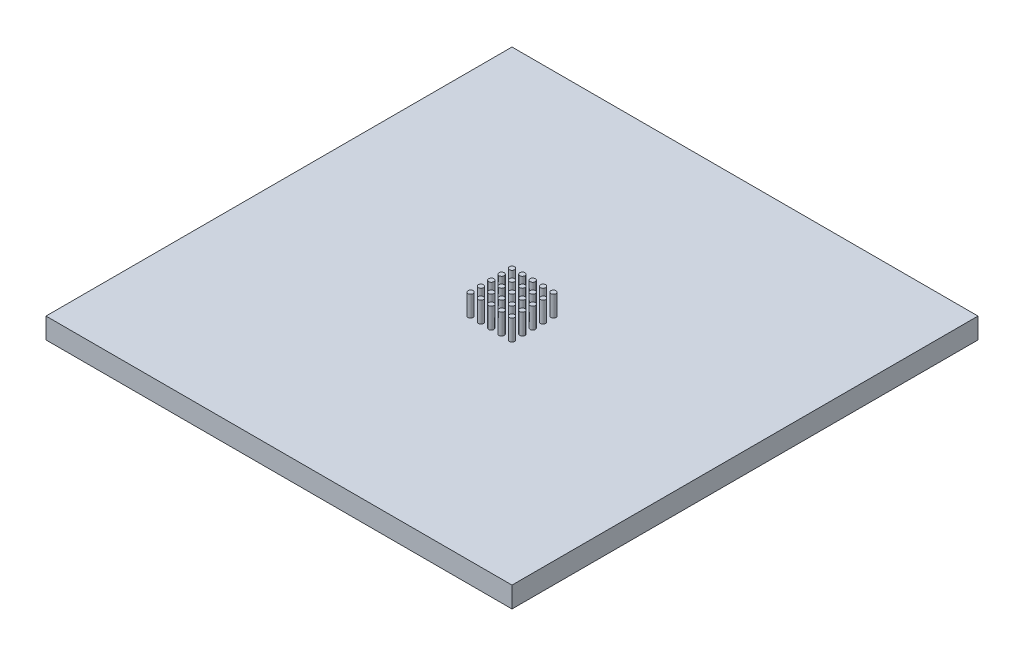
ISO-10303-21;
HEADER;
FILE_DESCRIPTION(('STEP AP214'),'2;1');
FILE_NAME('part.step','',(''),(''),'','','');
FILE_SCHEMA(('AUTOMOTIVE_DESIGN { 1 0 10303 214 1 1 1 1 }'));
ENDSEC;
DATA;
#1=APPLICATION_CONTEXT('core data for automotive mechanical design processes');
#2=APPLICATION_PROTOCOL_DEFINITION('international standard','automotive_design',2000,#1);
#3=PRODUCT_CONTEXT('',#1,'mechanical');
#4=PRODUCT('Part','Part','',(#3));
#5=PRODUCT_RELATED_PRODUCT_CATEGORY('part','',(#4));
#6=PRODUCT_DEFINITION_FORMATION('','',#4);
#7=PRODUCT_DEFINITION_CONTEXT('part definition',#1,'design');
#8=PRODUCT_DEFINITION('design','',#6,#7);
#9=PRODUCT_DEFINITION_SHAPE('','',#8);
#10=(LENGTH_UNIT() NAMED_UNIT(*) SI_UNIT(.MILLI.,.METRE.));
#11=(NAMED_UNIT(*) PLANE_ANGLE_UNIT() SI_UNIT($,.RADIAN.));
#12=(NAMED_UNIT(*) SI_UNIT($,.STERADIAN.) SOLID_ANGLE_UNIT());
#13=UNCERTAINTY_MEASURE_WITH_UNIT(LENGTH_MEASURE(1.E-05),#10,'distance_accuracy_value','');
#14=(GEOMETRIC_REPRESENTATION_CONTEXT(3) GLOBAL_UNCERTAINTY_ASSIGNED_CONTEXT((#13)) GLOBAL_UNIT_ASSIGNED_CONTEXT((#10,
#11,#12)) REPRESENTATION_CONTEXT('',''));
#15=CARTESIAN_POINT('',(0.,0.,0.));
#16=DIRECTION('',(0.,0.,1.));
#17=DIRECTION('',(1.,0.,0.));
#18=AXIS2_PLACEMENT_3D('',#15,#16,#17);
#19=CARTESIAN_POINT('',(2.,4.,-2.));
#20=DIRECTION('',(0.,1.,0.));
#21=DIRECTION('',(0.,0.,1.));
#22=AXIS2_PLACEMENT_3D('',#19,#20,#21);
#23=PLANE('',#22);
#24=CARTESIAN_POINT('',(2.,4.,-2.));
#25=DIRECTION('',(0.,1.,0.));
#26=DIRECTION('',(0.,0.,1.));
#27=AXIS2_PLACEMENT_3D('',#24,#25,#26);
#28=CIRCLE('',#27,0.25);
#29=CARTESIAN_POINT('',(2.,4.,-1.75));
#30=VERTEX_POINT('',#29);
#31=EDGE_CURVE('E11',#30,#30,#28,.T.);
#32=ORIENTED_EDGE('',*,*,#31,.T.);
#33=EDGE_LOOP('',(#32));
#34=FACE_BOUND('',#33,.T.);
#35=ADVANCED_FACE('F47',(#34),#23,.T.);
#36=CARTESIAN_POINT('',(2.,4.,-2.));
#37=DIRECTION('',(0.,-1.,0.));
#38=DIRECTION('',(0.,0.,-1.));
#39=AXIS2_PLACEMENT_3D('',#36,#37,#38);
#40=CYLINDRICAL_SURFACE('',#39,0.25);
#41=ORIENTED_EDGE('',*,*,#31,.F.);
#42=EDGE_LOOP('',(#41));
#43=FACE_BOUND('',#42,.T.);
#44=CARTESIAN_POINT('',(2.,2.,-2.));
#45=DIRECTION('',(0.,1.,0.));
#46=DIRECTION('',(0.,0.,1.));
#47=AXIS2_PLACEMENT_3D('',#44,#45,#46);
#48=CIRCLE('',#47,0.25);
#49=CARTESIAN_POINT('',(2.,2.,-1.75));
#50=VERTEX_POINT('',#49);
#51=EDGE_CURVE('E59',#50,#50,#48,.T.);
#52=ORIENTED_EDGE('',*,*,#51,.T.);
#53=EDGE_LOOP('',(#52));
#54=FACE_BOUND('',#53,.T.);
#55=ADVANCED_FACE('F321',(#43,#54),#40,.T.);
#56=CARTESIAN_POINT('',(2.,4.,-1.));
#57=DIRECTION('',(0.,1.,0.));
#58=DIRECTION('',(0.,0.,1.));
#59=AXIS2_PLACEMENT_3D('',#56,#57,#58);
#60=PLANE('',#59);
#61=CARTESIAN_POINT('',(2.,4.,-1.));
#62=DIRECTION('',(0.,1.,0.));
#63=DIRECTION('',(0.,0.,1.));
#64=AXIS2_PLACEMENT_3D('',#61,#62,#63);
#65=CIRCLE('',#64,0.25);
#66=CARTESIAN_POINT('',(2.,4.,-0.75));
#67=VERTEX_POINT('',#66);
#68=EDGE_CURVE('E311',#67,#67,#65,.T.);
#69=ORIENTED_EDGE('',*,*,#68,.T.);
#70=EDGE_LOOP('',(#69));
#71=FACE_BOUND('',#70,.T.);
#72=ADVANCED_FACE('F344',(#71),#60,.T.);
#73=CARTESIAN_POINT('',(2.,4.,-1.));
#74=DIRECTION('',(0.,-1.,0.));
#75=DIRECTION('',(0.,0.,-1.));
#76=AXIS2_PLACEMENT_3D('',#73,#74,#75);
#77=CYLINDRICAL_SURFACE('',#76,0.25);
#78=ORIENTED_EDGE('',*,*,#68,.F.);
#79=EDGE_LOOP('',(#78));
#80=FACE_BOUND('',#79,.T.);
#81=CARTESIAN_POINT('',(2.,2.,-1.));
#82=DIRECTION('',(0.,1.,0.));
#83=DIRECTION('',(0.,0.,1.));
#84=AXIS2_PLACEMENT_3D('',#81,#82,#83);
#85=CIRCLE('',#84,0.25);
#86=CARTESIAN_POINT('',(2.,2.,-0.75));
#87=VERTEX_POINT('',#86);
#88=EDGE_CURVE('E310',#87,#87,#85,.T.);
#89=ORIENTED_EDGE('',*,*,#88,.T.);
#90=EDGE_LOOP('',(#89));
#91=FACE_BOUND('',#90,.T.);
#92=ADVANCED_FACE('F350',(#80,#91),#77,.T.);
#93=CARTESIAN_POINT('',(2.,4.,0.));
#94=DIRECTION('',(0.,1.,0.));
#95=DIRECTION('',(0.,0.,1.));
#96=AXIS2_PLACEMENT_3D('',#93,#94,#95);
#97=PLANE('',#96);
#98=CARTESIAN_POINT('',(2.,4.,0.));
#99=DIRECTION('',(0.,1.,0.));
#100=DIRECTION('',(0.,0.,1.));
#101=AXIS2_PLACEMENT_3D('',#98,#99,#100);
#102=CIRCLE('',#101,0.25);
#103=CARTESIAN_POINT('',(2.,4.,0.25));
#104=VERTEX_POINT('',#103);
#105=EDGE_CURVE('E303',#104,#104,#102,.T.);
#106=ORIENTED_EDGE('',*,*,#105,.T.);
#107=EDGE_LOOP('',(#106));
#108=FACE_BOUND('',#107,.T.);
#109=ADVANCED_FACE('F352',(#108),#97,.T.);
#110=CARTESIAN_POINT('',(2.,4.,0.));
#111=DIRECTION('',(0.,-1.,0.));
#112=DIRECTION('',(0.,0.,-1.));
#113=AXIS2_PLACEMENT_3D('',#110,#111,#112);
#114=CYLINDRICAL_SURFACE('',#113,0.25);
#115=ORIENTED_EDGE('',*,*,#105,.F.);
#116=EDGE_LOOP('',(#115));
#117=FACE_BOUND('',#116,.T.);
#118=CARTESIAN_POINT('',(2.,2.,0.));
#119=DIRECTION('',(0.,1.,0.));
#120=DIRECTION('',(0.,0.,1.));
#121=AXIS2_PLACEMENT_3D('',#118,#119,#120);
#122=CIRCLE('',#121,0.25);
#123=CARTESIAN_POINT('',(2.,2.,0.25));
#124=VERTEX_POINT('',#123);
#125=EDGE_CURVE('E302',#124,#124,#122,.T.);
#126=ORIENTED_EDGE('',*,*,#125,.T.);
#127=EDGE_LOOP('',(#126));
#128=FACE_BOUND('',#127,.T.);
#129=ADVANCED_FACE('F359',(#117,#128),#114,.T.);
#130=CARTESIAN_POINT('',(2.,4.,1.));
#131=DIRECTION('',(0.,1.,0.));
#132=DIRECTION('',(0.,0.,1.));
#133=AXIS2_PLACEMENT_3D('',#130,#131,#132);
#134=PLANE('',#133);
#135=CARTESIAN_POINT('',(2.,4.,1.));
#136=DIRECTION('',(0.,1.,0.));
#137=DIRECTION('',(0.,0.,1.));
#138=AXIS2_PLACEMENT_3D('',#135,#136,#137);
#139=CIRCLE('',#138,0.25);
#140=CARTESIAN_POINT('',(2.,4.,1.25));
#141=VERTEX_POINT('',#140);
#142=EDGE_CURVE('E300',#141,#141,#139,.T.);
#143=ORIENTED_EDGE('',*,*,#142,.T.);
#144=EDGE_LOOP('',(#143));
#145=FACE_BOUND('',#144,.T.);
#146=ADVANCED_FACE('F363',(#145),#134,.T.);
#147=CARTESIAN_POINT('',(2.,4.,1.));
#148=DIRECTION('',(0.,-1.,0.));
#149=DIRECTION('',(0.,0.,-1.));
#150=AXIS2_PLACEMENT_3D('',#147,#148,#149);
#151=CYLINDRICAL_SURFACE('',#150,0.25);
#152=ORIENTED_EDGE('',*,*,#142,.F.);
#153=EDGE_LOOP('',(#152));
#154=FACE_BOUND('',#153,.T.);
#155=CARTESIAN_POINT('',(2.,2.,1.));
#156=DIRECTION('',(0.,1.,0.));
#157=DIRECTION('',(0.,0.,1.));
#158=AXIS2_PLACEMENT_3D('',#155,#156,#157);
#159=CIRCLE('',#158,0.25);
#160=CARTESIAN_POINT('',(2.,2.,1.25));
#161=VERTEX_POINT('',#160);
#162=EDGE_CURVE('E291',#161,#161,#159,.T.);
#163=ORIENTED_EDGE('',*,*,#162,.T.);
#164=EDGE_LOOP('',(#163));
#165=FACE_BOUND('',#164,.T.);
#166=ADVANCED_FACE('F364',(#154,#165),#151,.T.);
#167=CARTESIAN_POINT('',(2.,4.,2.));
#168=DIRECTION('',(0.,1.,0.));
#169=DIRECTION('',(0.,0.,1.));
#170=AXIS2_PLACEMENT_3D('',#167,#168,#169);
#171=PLANE('',#170);
#172=CARTESIAN_POINT('',(2.,4.,2.));
#173=DIRECTION('',(0.,1.,0.));
#174=DIRECTION('',(0.,0.,1.));
#175=AXIS2_PLACEMENT_3D('',#172,#173,#174);
#176=CIRCLE('',#175,0.25);
#177=CARTESIAN_POINT('',(2.,4.,2.25));
#178=VERTEX_POINT('',#177);
#179=EDGE_CURVE('E286',#178,#178,#176,.T.);
#180=ORIENTED_EDGE('',*,*,#179,.T.);
#181=EDGE_LOOP('',(#180));
#182=FACE_BOUND('',#181,.T.);
#183=ADVANCED_FACE('F369',(#182),#171,.T.);
#184=CARTESIAN_POINT('',(2.,4.,2.));
#185=DIRECTION('',(0.,-1.,0.));
#186=DIRECTION('',(0.,0.,-1.));
#187=AXIS2_PLACEMENT_3D('',#184,#185,#186);
#188=CYLINDRICAL_SURFACE('',#187,0.25);
#189=ORIENTED_EDGE('',*,*,#179,.F.);
#190=EDGE_LOOP('',(#189));
#191=FACE_BOUND('',#190,.T.);
#192=CARTESIAN_POINT('',(2.,2.,2.));
#193=DIRECTION('',(0.,1.,0.));
#194=DIRECTION('',(0.,0.,1.));
#195=AXIS2_PLACEMENT_3D('',#192,#193,#194);
#196=CIRCLE('',#195,0.25);
#197=CARTESIAN_POINT('',(2.,2.,2.25));
#198=VERTEX_POINT('',#197);
#199=EDGE_CURVE('E284',#198,#198,#196,.T.);
#200=ORIENTED_EDGE('',*,*,#199,.T.);
#201=EDGE_LOOP('',(#200));
#202=FACE_BOUND('',#201,.T.);
#203=ADVANCED_FACE('F373',(#191,#202),#188,.T.);
#204=CARTESIAN_POINT('',(1.,4.,-2.));
#205=DIRECTION('',(0.,1.,0.));
#206=DIRECTION('',(0.,0.,1.));
#207=AXIS2_PLACEMENT_3D('',#204,#205,#206);
#208=PLANE('',#207);
#209=CARTESIAN_POINT('',(1.,4.,-2.));
#210=DIRECTION('',(0.,1.,0.));
#211=DIRECTION('',(0.,0.,1.));
#212=AXIS2_PLACEMENT_3D('',#209,#210,#211);
#213=CIRCLE('',#212,0.25);
#214=CARTESIAN_POINT('',(1.,4.,-1.75));
#215=VERTEX_POINT('',#214);
#216=EDGE_CURVE('E281',#215,#215,#213,.T.);
#217=ORIENTED_EDGE('',*,*,#216,.T.);
#218=EDGE_LOOP('',(#217));
#219=FACE_BOUND('',#218,.T.);
#220=ADVANCED_FACE('F380',(#219),#208,.T.);
#221=CARTESIAN_POINT('',(1.,4.,-2.));
#222=DIRECTION('',(0.,-1.,0.));
#223=DIRECTION('',(0.,0.,-1.));
#224=AXIS2_PLACEMENT_3D('',#221,#222,#223);
#225=CYLINDRICAL_SURFACE('',#224,0.25);
#226=ORIENTED_EDGE('',*,*,#216,.F.);
#227=EDGE_LOOP('',(#226));
#228=FACE_BOUND('',#227,.T.);
#229=CARTESIAN_POINT('',(1.,2.,-2.));
#230=DIRECTION('',(0.,1.,0.));
#231=DIRECTION('',(0.,0.,1.));
#232=AXIS2_PLACEMENT_3D('',#229,#230,#231);
#233=CIRCLE('',#232,0.25);
#234=CARTESIAN_POINT('',(1.,2.,-1.75));
#235=VERTEX_POINT('',#234);
#236=EDGE_CURVE('E280',#235,#235,#233,.T.);
#237=ORIENTED_EDGE('',*,*,#236,.T.);
#238=EDGE_LOOP('',(#237));
#239=FACE_BOUND('',#238,.T.);
#240=ADVANCED_FACE('F381',(#228,#239),#225,.T.);
#241=CARTESIAN_POINT('',(1.,4.,-1.));
#242=DIRECTION('',(0.,1.,0.));
#243=DIRECTION('',(0.,0.,1.));
#244=AXIS2_PLACEMENT_3D('',#241,#242,#243);
#245=PLANE('',#244);
#246=CARTESIAN_POINT('',(1.,4.,-1.));
#247=DIRECTION('',(0.,1.,0.));
#248=DIRECTION('',(0.,0.,1.));
#249=AXIS2_PLACEMENT_3D('',#246,#247,#248);
#250=CIRCLE('',#249,0.25);
#251=CARTESIAN_POINT('',(1.,4.,-0.75));
#252=VERTEX_POINT('',#251);
#253=EDGE_CURVE('E272',#252,#252,#250,.T.);
#254=ORIENTED_EDGE('',*,*,#253,.T.);
#255=EDGE_LOOP('',(#254));
#256=FACE_BOUND('',#255,.T.);
#257=ADVANCED_FACE('F384',(#256),#245,.T.);
#258=CARTESIAN_POINT('',(1.,4.,-1.));
#259=DIRECTION('',(0.,-1.,0.));
#260=DIRECTION('',(0.,0.,-1.));
#261=AXIS2_PLACEMENT_3D('',#258,#259,#260);
#262=CYLINDRICAL_SURFACE('',#261,0.25);
#263=ORIENTED_EDGE('',*,*,#253,.F.);
#264=EDGE_LOOP('',(#263));
#265=FACE_BOUND('',#264,.T.);
#266=CARTESIAN_POINT('',(1.,2.,-1.));
#267=DIRECTION('',(0.,1.,0.));
#268=DIRECTION('',(0.,0.,1.));
#269=AXIS2_PLACEMENT_3D('',#266,#267,#268);
#270=CIRCLE('',#269,0.25);
#271=CARTESIAN_POINT('',(1.,2.,-0.75));
#272=VERTEX_POINT('',#271);
#273=EDGE_CURVE('E267',#272,#272,#270,.T.);
#274=ORIENTED_EDGE('',*,*,#273,.T.);
#275=EDGE_LOOP('',(#274));
#276=FACE_BOUND('',#275,.T.);
#277=ADVANCED_FACE('F386',(#265,#276),#262,.T.);
#278=CARTESIAN_POINT('',(1.,4.,0.));
#279=DIRECTION('',(0.,1.,0.));
#280=DIRECTION('',(0.,0.,1.));
#281=AXIS2_PLACEMENT_3D('',#278,#279,#280);
#282=PLANE('',#281);
#283=CARTESIAN_POINT('',(1.,4.,0.));
#284=DIRECTION('',(0.,1.,0.));
#285=DIRECTION('',(0.,0.,1.));
#286=AXIS2_PLACEMENT_3D('',#283,#284,#285);
#287=CIRCLE('',#286,0.25);
#288=CARTESIAN_POINT('',(1.,4.,0.25));
#289=VERTEX_POINT('',#288);
#290=EDGE_CURVE('E264',#289,#289,#287,.T.);
#291=ORIENTED_EDGE('',*,*,#290,.T.);
#292=EDGE_LOOP('',(#291));
#293=FACE_BOUND('',#292,.T.);
#294=ADVANCED_FACE('F392',(#293),#282,.T.);
#295=CARTESIAN_POINT('',(1.,4.,0.));
#296=DIRECTION('',(0.,-1.,0.));
#297=DIRECTION('',(0.,0.,-1.));
#298=AXIS2_PLACEMENT_3D('',#295,#296,#297);
#299=CYLINDRICAL_SURFACE('',#298,0.25);
#300=ORIENTED_EDGE('',*,*,#290,.F.);
#301=EDGE_LOOP('',(#300));
#302=FACE_BOUND('',#301,.T.);
#303=CARTESIAN_POINT('',(1.,2.,0.));
#304=DIRECTION('',(0.,1.,0.));
#305=DIRECTION('',(0.,0.,1.));
#306=AXIS2_PLACEMENT_3D('',#303,#304,#305);
#307=CIRCLE('',#306,0.25);
#308=CARTESIAN_POINT('',(1.,2.,0.25));
#309=VERTEX_POINT('',#308);
#310=EDGE_CURVE('E261',#309,#309,#307,.T.);
#311=ORIENTED_EDGE('',*,*,#310,.T.);
#312=EDGE_LOOP('',(#311));
#313=FACE_BOUND('',#312,.T.);
#314=ADVANCED_FACE('F399',(#302,#313),#299,.T.);
#315=CARTESIAN_POINT('',(1.,4.,1.));
#316=DIRECTION('',(0.,1.,0.));
#317=DIRECTION('',(0.,0.,1.));
#318=AXIS2_PLACEMENT_3D('',#315,#316,#317);
#319=PLANE('',#318);
#320=CARTESIAN_POINT('',(1.,4.,1.));
#321=DIRECTION('',(0.,1.,0.));
#322=DIRECTION('',(0.,0.,1.));
#323=AXIS2_PLACEMENT_3D('',#320,#321,#322);
#324=CIRCLE('',#323,0.25);
#325=CARTESIAN_POINT('',(1.,4.,1.25));
#326=VERTEX_POINT('',#325);
#327=EDGE_CURVE('E260',#326,#326,#324,.T.);
#328=ORIENTED_EDGE('',*,*,#327,.T.);
#329=EDGE_LOOP('',(#328));
#330=FACE_BOUND('',#329,.T.);
#331=ADVANCED_FACE('F402',(#330),#319,.T.);
#332=CARTESIAN_POINT('',(1.,4.,1.));
#333=DIRECTION('',(0.,-1.,0.));
#334=DIRECTION('',(0.,0.,-1.));
#335=AXIS2_PLACEMENT_3D('',#332,#333,#334);
#336=CYLINDRICAL_SURFACE('',#335,0.25);
#337=ORIENTED_EDGE('',*,*,#327,.F.);
#338=EDGE_LOOP('',(#337));
#339=FACE_BOUND('',#338,.T.);
#340=CARTESIAN_POINT('',(1.,2.,1.));
#341=DIRECTION('',(0.,1.,0.));
#342=DIRECTION('',(0.,0.,1.));
#343=AXIS2_PLACEMENT_3D('',#340,#341,#342);
#344=CIRCLE('',#343,0.25);
#345=CARTESIAN_POINT('',(1.,2.,1.25));
#346=VERTEX_POINT('',#345);
#347=EDGE_CURVE('E251',#346,#346,#344,.T.);
#348=ORIENTED_EDGE('',*,*,#347,.T.);
#349=EDGE_LOOP('',(#348));
#350=FACE_BOUND('',#349,.T.);
#351=ADVANCED_FACE('F403',(#339,#350),#336,.T.);
#352=CARTESIAN_POINT('',(1.,4.,2.));
#353=DIRECTION('',(0.,1.,0.));
#354=DIRECTION('',(0.,0.,1.));
#355=AXIS2_PLACEMENT_3D('',#352,#353,#354);
#356=PLANE('',#355);
#357=CARTESIAN_POINT('',(1.,4.,2.));
#358=DIRECTION('',(0.,1.,0.));
#359=DIRECTION('',(0.,0.,1.));
#360=AXIS2_PLACEMENT_3D('',#357,#358,#359);
#361=CIRCLE('',#360,0.25);
#362=CARTESIAN_POINT('',(1.,4.,2.25));
#363=VERTEX_POINT('',#362);
#364=EDGE_CURVE('E246',#363,#363,#361,.T.);
#365=ORIENTED_EDGE('',*,*,#364,.T.);
#366=EDGE_LOOP('',(#365));
#367=FACE_BOUND('',#366,.T.);
#368=ADVANCED_FACE('F408',(#367),#356,.T.);
#369=CARTESIAN_POINT('',(1.,4.,2.));
#370=DIRECTION('',(0.,-1.,0.));
#371=DIRECTION('',(0.,0.,-1.));
#372=AXIS2_PLACEMENT_3D('',#369,#370,#371);
#373=CYLINDRICAL_SURFACE('',#372,0.25);
#374=ORIENTED_EDGE('',*,*,#364,.F.);
#375=EDGE_LOOP('',(#374));
#376=FACE_BOUND('',#375,.T.);
#377=CARTESIAN_POINT('',(1.,2.,2.));
#378=DIRECTION('',(0.,1.,0.));
#379=DIRECTION('',(0.,0.,1.));
#380=AXIS2_PLACEMENT_3D('',#377,#378,#379);
#381=CIRCLE('',#380,0.25);
#382=CARTESIAN_POINT('',(1.,2.,2.25));
#383=VERTEX_POINT('',#382);
#384=EDGE_CURVE('E244',#383,#383,#381,.T.);
#385=ORIENTED_EDGE('',*,*,#384,.T.);
#386=EDGE_LOOP('',(#385));
#387=FACE_BOUND('',#386,.T.);
#388=ADVANCED_FACE('F415',(#376,#387),#373,.T.);
#389=CARTESIAN_POINT('',(0.,4.,-2.));
#390=DIRECTION('',(0.,1.,0.));
#391=DIRECTION('',(0.,0.,1.));
#392=AXIS2_PLACEMENT_3D('',#389,#390,#391);
#393=PLANE('',#392);
#394=CARTESIAN_POINT('',(0.,4.,-2.));
#395=DIRECTION('',(0.,1.,0.));
#396=DIRECTION('',(0.,0.,1.));
#397=AXIS2_PLACEMENT_3D('',#394,#395,#396);
#398=CIRCLE('',#397,0.25);
#399=CARTESIAN_POINT('',(0.,4.,-1.75));
#400=VERTEX_POINT('',#399);
#401=EDGE_CURVE('E241',#400,#400,#398,.T.);
#402=ORIENTED_EDGE('',*,*,#401,.T.);
#403=EDGE_LOOP('',(#402));
#404=FACE_BOUND('',#403,.T.);
#405=ADVANCED_FACE('F417',(#404),#393,.T.);
#406=CARTESIAN_POINT('',(0.,4.,-2.));
#407=DIRECTION('',(0.,-1.,0.));
#408=DIRECTION('',(0.,0.,-1.));
#409=AXIS2_PLACEMENT_3D('',#406,#407,#408);
#410=CYLINDRICAL_SURFACE('',#409,0.25);
#411=ORIENTED_EDGE('',*,*,#401,.F.);
#412=EDGE_LOOP('',(#411));
#413=FACE_BOUND('',#412,.T.);
#414=CARTESIAN_POINT('',(0.,2.,-2.));
#415=DIRECTION('',(0.,1.,0.));
#416=DIRECTION('',(0.,0.,1.));
#417=AXIS2_PLACEMENT_3D('',#414,#415,#416);
#418=CIRCLE('',#417,0.25);
#419=CARTESIAN_POINT('',(0.,2.,-1.75));
#420=VERTEX_POINT('',#419);
#421=EDGE_CURVE('E240',#420,#420,#418,.T.);
#422=ORIENTED_EDGE('',*,*,#421,.T.);
#423=EDGE_LOOP('',(#422));
#424=FACE_BOUND('',#423,.T.);
#425=ADVANCED_FACE('F423',(#413,#424),#410,.T.);
#426=CARTESIAN_POINT('',(0.,4.,-1.));
#427=DIRECTION('',(0.,1.,0.));
#428=DIRECTION('',(0.,0.,1.));
#429=AXIS2_PLACEMENT_3D('',#426,#427,#428);
#430=PLANE('',#429);
#431=CARTESIAN_POINT('',(0.,4.,-1.));
#432=DIRECTION('',(0.,1.,0.));
#433=DIRECTION('',(0.,0.,1.));
#434=AXIS2_PLACEMENT_3D('',#431,#432,#433);
#435=CIRCLE('',#434,0.25);
#436=CARTESIAN_POINT('',(0.,4.,-0.75));
#437=VERTEX_POINT('',#436);
#438=EDGE_CURVE('E235',#437,#437,#435,.T.);
#439=ORIENTED_EDGE('',*,*,#438,.T.);
#440=EDGE_LOOP('',(#439));
#441=FACE_BOUND('',#440,.T.);
#442=ADVANCED_FACE('F422',(#441),#430,.T.);
#443=CARTESIAN_POINT('',(0.,4.,-1.));
#444=DIRECTION('',(0.,-1.,0.));
#445=DIRECTION('',(0.,0.,-1.));
#446=AXIS2_PLACEMENT_3D('',#443,#444,#445);
#447=CYLINDRICAL_SURFACE('',#446,0.25);
#448=ORIENTED_EDGE('',*,*,#438,.F.);
#449=EDGE_LOOP('',(#448));
#450=FACE_BOUND('',#449,.T.);
#451=CARTESIAN_POINT('',(0.,2.,-1.));
#452=DIRECTION('',(0.,1.,0.));
#453=DIRECTION('',(0.,0.,1.));
#454=AXIS2_PLACEMENT_3D('',#451,#452,#453);
#455=CIRCLE('',#454,0.25);
#456=CARTESIAN_POINT('',(0.,2.,-0.75));
#457=VERTEX_POINT('',#456);
#458=EDGE_CURVE('E228',#457,#457,#455,.T.);
#459=ORIENTED_EDGE('',*,*,#458,.T.);
#460=EDGE_LOOP('',(#459));
#461=FACE_BOUND('',#460,.T.);
#462=ADVANCED_FACE('F427',(#450,#461),#447,.T.);
#463=CARTESIAN_POINT('',(0.,4.,0.));
#464=DIRECTION('',(0.,1.,0.));
#465=DIRECTION('',(0.,0.,1.));
#466=AXIS2_PLACEMENT_3D('',#463,#464,#465);
#467=PLANE('',#466);
#468=CARTESIAN_POINT('',(0.,4.,0.));
#469=DIRECTION('',(0.,1.,0.));
#470=DIRECTION('',(0.,0.,1.));
#471=AXIS2_PLACEMENT_3D('',#468,#469,#470);
#472=CIRCLE('',#471,0.25);
#473=CARTESIAN_POINT('',(0.,4.,0.25));
#474=VERTEX_POINT('',#473);
#475=EDGE_CURVE('E223',#474,#474,#472,.T.);
#476=ORIENTED_EDGE('',*,*,#475,.T.);
#477=EDGE_LOOP('',(#476));
#478=FACE_BOUND('',#477,.T.);
#479=ADVANCED_FACE('F433',(#478),#467,.T.);
#480=CARTESIAN_POINT('',(0.,4.,0.));
#481=DIRECTION('',(0.,-1.,0.));
#482=DIRECTION('',(0.,0.,-1.));
#483=AXIS2_PLACEMENT_3D('',#480,#481,#482);
#484=CYLINDRICAL_SURFACE('',#483,0.25);
#485=ORIENTED_EDGE('',*,*,#475,.F.);
#486=EDGE_LOOP('',(#485));
#487=FACE_BOUND('',#486,.T.);
#488=CARTESIAN_POINT('',(0.,2.,0.));
#489=DIRECTION('',(0.,1.,0.));
#490=DIRECTION('',(0.,0.,1.));
#491=AXIS2_PLACEMENT_3D('',#488,#489,#490);
#492=CIRCLE('',#491,0.25);
#493=CARTESIAN_POINT('',(0.,2.,0.25));
#494=VERTEX_POINT('',#493);
#495=EDGE_CURVE('E222',#494,#494,#492,.T.);
#496=ORIENTED_EDGE('',*,*,#495,.T.);
#497=EDGE_LOOP('',(#496));
#498=FACE_BOUND('',#497,.T.);
#499=ADVANCED_FACE('F440',(#487,#498),#484,.T.);
#500=CARTESIAN_POINT('',(0.,4.,1.));
#501=DIRECTION('',(0.,1.,0.));
#502=DIRECTION('',(0.,0.,1.));
#503=AXIS2_PLACEMENT_3D('',#500,#501,#502);
#504=PLANE('',#503);
#505=CARTESIAN_POINT('',(0.,4.,1.));
#506=DIRECTION('',(0.,1.,0.));
#507=DIRECTION('',(0.,0.,1.));
#508=AXIS2_PLACEMENT_3D('',#505,#506,#507);
#509=CIRCLE('',#508,0.25);
#510=CARTESIAN_POINT('',(0.,4.,1.25));
#511=VERTEX_POINT('',#510);
#512=EDGE_CURVE('E220',#511,#511,#509,.T.);
#513=ORIENTED_EDGE('',*,*,#512,.T.);
#514=EDGE_LOOP('',(#513));
#515=FACE_BOUND('',#514,.T.);
#516=ADVANCED_FACE('F442',(#515),#504,.T.);
#517=CARTESIAN_POINT('',(0.,4.,1.));
#518=DIRECTION('',(0.,-1.,0.));
#519=DIRECTION('',(0.,0.,-1.));
#520=AXIS2_PLACEMENT_3D('',#517,#518,#519);
#521=CYLINDRICAL_SURFACE('',#520,0.25);
#522=ORIENTED_EDGE('',*,*,#512,.F.);
#523=EDGE_LOOP('',(#522));
#524=FACE_BOUND('',#523,.T.);
#525=CARTESIAN_POINT('',(0.,2.,1.));
#526=DIRECTION('',(0.,1.,0.));
#527=DIRECTION('',(0.,0.,1.));
#528=AXIS2_PLACEMENT_3D('',#525,#526,#527);
#529=CIRCLE('',#528,0.25);
#530=CARTESIAN_POINT('',(0.,2.,1.25));
#531=VERTEX_POINT('',#530);
#532=EDGE_CURVE('E213',#531,#531,#529,.T.);
#533=ORIENTED_EDGE('',*,*,#532,.T.);
#534=EDGE_LOOP('',(#533));
#535=FACE_BOUND('',#534,.T.);
#536=ADVANCED_FACE('F443',(#524,#535),#521,.T.);
#537=CARTESIAN_POINT('',(0.,4.,2.));
#538=DIRECTION('',(0.,1.,0.));
#539=DIRECTION('',(0.,0.,1.));
#540=AXIS2_PLACEMENT_3D('',#537,#538,#539);
#541=PLANE('',#540);
#542=CARTESIAN_POINT('',(0.,4.,2.));
#543=DIRECTION('',(0.,1.,0.));
#544=DIRECTION('',(0.,0.,1.));
#545=AXIS2_PLACEMENT_3D('',#542,#543,#544);
#546=CIRCLE('',#545,0.25);
#547=CARTESIAN_POINT('',(0.,4.,2.25));
#548=VERTEX_POINT('',#547);
#549=EDGE_CURVE('E207',#548,#548,#546,.T.);
#550=ORIENTED_EDGE('',*,*,#549,.T.);
#551=EDGE_LOOP('',(#550));
#552=FACE_BOUND('',#551,.T.);
#553=ADVANCED_FACE('F448',(#552),#541,.T.);
#554=CARTESIAN_POINT('',(0.,4.,2.));
#555=DIRECTION('',(0.,-1.,0.));
#556=DIRECTION('',(0.,0.,-1.));
#557=AXIS2_PLACEMENT_3D('',#554,#555,#556);
#558=CYLINDRICAL_SURFACE('',#557,0.25);
#559=ORIENTED_EDGE('',*,*,#549,.F.);
#560=EDGE_LOOP('',(#559));
#561=FACE_BOUND('',#560,.T.);
#562=CARTESIAN_POINT('',(0.,2.,2.));
#563=DIRECTION('',(0.,1.,0.));
#564=DIRECTION('',(0.,0.,1.));
#565=AXIS2_PLACEMENT_3D('',#562,#563,#564);
#566=CIRCLE('',#565,0.25);
#567=CARTESIAN_POINT('',(0.,2.,2.25));
#568=VERTEX_POINT('',#567);
#569=EDGE_CURVE('E202',#568,#568,#566,.T.);
#570=ORIENTED_EDGE('',*,*,#569,.T.);
#571=EDGE_LOOP('',(#570));
#572=FACE_BOUND('',#571,.T.);
#573=ADVANCED_FACE('F455',(#561,#572),#558,.T.);
#574=CARTESIAN_POINT('',(-1.,4.,-2.));
#575=DIRECTION('',(0.,1.,0.));
#576=DIRECTION('',(0.,0.,1.));
#577=AXIS2_PLACEMENT_3D('',#574,#575,#576);
#578=PLANE('',#577);
#579=CARTESIAN_POINT('',(-1.,4.,-2.));
#580=DIRECTION('',(0.,1.,0.));
#581=DIRECTION('',(0.,0.,1.));
#582=AXIS2_PLACEMENT_3D('',#579,#580,#581);
#583=CIRCLE('',#582,0.25);
#584=CARTESIAN_POINT('',(-1.,4.,-1.75));
#585=VERTEX_POINT('',#584);
#586=EDGE_CURVE('E203',#585,#585,#583,.T.);
#587=ORIENTED_EDGE('',*,*,#586,.T.);
#588=EDGE_LOOP('',(#587));
#589=FACE_BOUND('',#588,.T.);
#590=ADVANCED_FACE('F460',(#589),#578,.T.);
#591=CARTESIAN_POINT('',(-1.,4.,-2.));
#592=DIRECTION('',(0.,-1.,0.));
#593=DIRECTION('',(0.,0.,-1.));
#594=AXIS2_PLACEMENT_3D('',#591,#592,#593);
#595=CYLINDRICAL_SURFACE('',#594,0.25);
#596=ORIENTED_EDGE('',*,*,#586,.F.);
#597=EDGE_LOOP('',(#596));
#598=FACE_BOUND('',#597,.T.);
#599=CARTESIAN_POINT('',(-1.,2.,-2.));
#600=DIRECTION('',(0.,1.,0.));
#601=DIRECTION('',(0.,0.,1.));
#602=AXIS2_PLACEMENT_3D('',#599,#600,#601);
#603=CIRCLE('',#602,0.25);
#604=CARTESIAN_POINT('',(-1.,2.,-1.75));
#605=VERTEX_POINT('',#604);
#606=EDGE_CURVE('E196',#605,#605,#603,.T.);
#607=ORIENTED_EDGE('',*,*,#606,.T.);
#608=EDGE_LOOP('',(#607));
#609=FACE_BOUND('',#608,.T.);
#610=ADVANCED_FACE('F461',(#598,#609),#595,.T.);
#611=CARTESIAN_POINT('',(-1.,4.,-1.));
#612=DIRECTION('',(0.,1.,0.));
#613=DIRECTION('',(0.,0.,1.));
#614=AXIS2_PLACEMENT_3D('',#611,#612,#613);
#615=PLANE('',#614);
#616=CARTESIAN_POINT('',(-1.,4.,-1.));
#617=DIRECTION('',(0.,1.,0.));
#618=DIRECTION('',(0.,0.,1.));
#619=AXIS2_PLACEMENT_3D('',#616,#617,#618);
#620=CIRCLE('',#619,0.25);
#621=CARTESIAN_POINT('',(-1.,4.,-0.75));
#622=VERTEX_POINT('',#621);
#623=EDGE_CURVE('E191',#622,#622,#620,.T.);
#624=ORIENTED_EDGE('',*,*,#623,.T.);
#625=EDGE_LOOP('',(#624));
#626=FACE_BOUND('',#625,.T.);
#627=ADVANCED_FACE('F464',(#626),#615,.T.);
#628=CARTESIAN_POINT('',(-1.,4.,-1.));
#629=DIRECTION('',(0.,-1.,0.));
#630=DIRECTION('',(0.,0.,-1.));
#631=AXIS2_PLACEMENT_3D('',#628,#629,#630);
#632=CYLINDRICAL_SURFACE('',#631,0.25);
#633=ORIENTED_EDGE('',*,*,#623,.F.);
#634=EDGE_LOOP('',(#633));
#635=FACE_BOUND('',#634,.T.);
#636=CARTESIAN_POINT('',(-1.,2.,-1.));
#637=DIRECTION('',(0.,1.,0.));
#638=DIRECTION('',(0.,0.,1.));
#639=AXIS2_PLACEMENT_3D('',#636,#637,#638);
#640=CIRCLE('',#639,0.25);
#641=CARTESIAN_POINT('',(-1.,2.,-0.75));
#642=VERTEX_POINT('',#641);
#643=EDGE_CURVE('E189',#642,#642,#640,.T.);
#644=ORIENTED_EDGE('',*,*,#643,.T.);
#645=EDGE_LOOP('',(#644));
#646=FACE_BOUND('',#645,.T.);
#647=ADVANCED_FACE('F466',(#635,#646),#632,.T.);
#648=CARTESIAN_POINT('',(-1.,4.,0.));
#649=DIRECTION('',(0.,1.,0.));
#650=DIRECTION('',(0.,0.,1.));
#651=AXIS2_PLACEMENT_3D('',#648,#649,#650);
#652=PLANE('',#651);
#653=CARTESIAN_POINT('',(-1.,4.,0.));
#654=DIRECTION('',(0.,1.,0.));
#655=DIRECTION('',(0.,0.,1.));
#656=AXIS2_PLACEMENT_3D('',#653,#654,#655);
#657=CIRCLE('',#656,0.25);
#658=CARTESIAN_POINT('',(-1.,4.,0.25));
#659=VERTEX_POINT('',#658);
#660=EDGE_CURVE('E186',#659,#659,#657,.T.);
#661=ORIENTED_EDGE('',*,*,#660,.T.);
#662=EDGE_LOOP('',(#661));
#663=FACE_BOUND('',#662,.T.);
#664=ADVANCED_FACE('F471',(#663),#652,.T.);
#665=CARTESIAN_POINT('',(-1.,4.,0.));
#666=DIRECTION('',(0.,-1.,0.));
#667=DIRECTION('',(0.,0.,-1.));
#668=AXIS2_PLACEMENT_3D('',#665,#666,#667);
#669=CYLINDRICAL_SURFACE('',#668,0.25);
#670=ORIENTED_EDGE('',*,*,#660,.F.);
#671=EDGE_LOOP('',(#670));
#672=FACE_BOUND('',#671,.T.);
#673=CARTESIAN_POINT('',(-1.,2.,0.));
#674=DIRECTION('',(0.,1.,0.));
#675=DIRECTION('',(0.,0.,1.));
#676=AXIS2_PLACEMENT_3D('',#673,#674,#675);
#677=CIRCLE('',#676,0.25);
#678=CARTESIAN_POINT('',(-1.,2.,0.25));
#679=VERTEX_POINT('',#678);
#680=EDGE_CURVE('E185',#679,#679,#677,.T.);
#681=ORIENTED_EDGE('',*,*,#680,.T.);
#682=EDGE_LOOP('',(#681));
#683=FACE_BOUND('',#682,.T.);
#684=ADVANCED_FACE('F480',(#672,#683),#669,.T.);
#685=CARTESIAN_POINT('',(-1.,4.,1.));
#686=DIRECTION('',(0.,1.,0.));
#687=DIRECTION('',(0.,0.,1.));
#688=AXIS2_PLACEMENT_3D('',#685,#686,#687);
#689=PLANE('',#688);
#690=CARTESIAN_POINT('',(-1.,4.,1.));
#691=DIRECTION('',(0.,1.,0.));
#692=DIRECTION('',(0.,0.,1.));
#693=AXIS2_PLACEMENT_3D('',#690,#691,#692);
#694=CIRCLE('',#693,0.25);
#695=CARTESIAN_POINT('',(-1.,4.,1.25));
#696=VERTEX_POINT('',#695);
#697=EDGE_CURVE('E180',#696,#696,#694,.T.);
#698=ORIENTED_EDGE('',*,*,#697,.T.);
#699=EDGE_LOOP('',(#698));
#700=FACE_BOUND('',#699,.T.);
#701=ADVANCED_FACE('F481',(#700),#689,.T.);
#702=CARTESIAN_POINT('',(-1.,4.,1.));
#703=DIRECTION('',(0.,-1.,0.));
#704=DIRECTION('',(0.,0.,-1.));
#705=AXIS2_PLACEMENT_3D('',#702,#703,#704);
#706=CYLINDRICAL_SURFACE('',#705,0.25);
#707=ORIENTED_EDGE('',*,*,#697,.F.);
#708=EDGE_LOOP('',(#707));
#709=FACE_BOUND('',#708,.T.);
#710=CARTESIAN_POINT('',(-1.,2.,1.));
#711=DIRECTION('',(0.,1.,0.));
#712=DIRECTION('',(0.,0.,1.));
#713=AXIS2_PLACEMENT_3D('',#710,#711,#712);
#714=CIRCLE('',#713,0.25);
#715=CARTESIAN_POINT('',(-1.,2.,1.25));
#716=VERTEX_POINT('',#715);
#717=EDGE_CURVE('E173',#716,#716,#714,.T.);
#718=ORIENTED_EDGE('',*,*,#717,.T.);
#719=EDGE_LOOP('',(#718));
#720=FACE_BOUND('',#719,.T.);
#721=ADVANCED_FACE('F484',(#709,#720),#706,.T.);
#722=CARTESIAN_POINT('',(-1.,4.,2.));
#723=DIRECTION('',(0.,1.,0.));
#724=DIRECTION('',(0.,0.,1.));
#725=AXIS2_PLACEMENT_3D('',#722,#723,#724);
#726=PLANE('',#725);
#727=CARTESIAN_POINT('',(-1.,4.,2.));
#728=DIRECTION('',(0.,1.,0.));
#729=DIRECTION('',(0.,0.,1.));
#730=AXIS2_PLACEMENT_3D('',#727,#728,#729);
#731=CIRCLE('',#730,0.25);
#732=CARTESIAN_POINT('',(-1.,4.,2.25));
#733=VERTEX_POINT('',#732);
#734=EDGE_CURVE('E168',#733,#733,#731,.T.);
#735=ORIENTED_EDGE('',*,*,#734,.T.);
#736=EDGE_LOOP('',(#735));
#737=FACE_BOUND('',#736,.T.);
#738=ADVANCED_FACE('F487',(#737),#726,.T.);
#739=CARTESIAN_POINT('',(-1.,4.,2.));
#740=DIRECTION('',(0.,-1.,0.));
#741=DIRECTION('',(0.,0.,-1.));
#742=AXIS2_PLACEMENT_3D('',#739,#740,#741);
#743=CYLINDRICAL_SURFACE('',#742,0.25);
#744=ORIENTED_EDGE('',*,*,#734,.F.);
#745=EDGE_LOOP('',(#744));
#746=FACE_BOUND('',#745,.T.);
#747=CARTESIAN_POINT('',(-1.,2.,2.));
#748=DIRECTION('',(0.,1.,0.));
#749=DIRECTION('',(0.,0.,1.));
#750=AXIS2_PLACEMENT_3D('',#747,#748,#749);
#751=CIRCLE('',#750,0.25);
#752=CARTESIAN_POINT('',(-1.,2.,2.25));
#753=VERTEX_POINT('',#752);
#754=EDGE_CURVE('E167',#753,#753,#751,.T.);
#755=ORIENTED_EDGE('',*,*,#754,.T.);
#756=EDGE_LOOP('',(#755));
#757=FACE_BOUND('',#756,.T.);
#758=ADVANCED_FACE('F492',(#746,#757),#743,.T.);
#759=CARTESIAN_POINT('',(-2.,4.,-2.));
#760=DIRECTION('',(0.,1.,0.));
#761=DIRECTION('',(0.,0.,1.));
#762=AXIS2_PLACEMENT_3D('',#759,#760,#761);
#763=PLANE('',#762);
#764=CARTESIAN_POINT('',(-2.,4.,-2.));
#765=DIRECTION('',(0.,1.,0.));
#766=DIRECTION('',(0.,0.,1.));
#767=AXIS2_PLACEMENT_3D('',#764,#765,#766);
#768=CIRCLE('',#767,0.25);
#769=CARTESIAN_POINT('',(-2.,4.,-1.75));
#770=VERTEX_POINT('',#769);
#771=EDGE_CURVE('E165',#770,#770,#768,.T.);
#772=ORIENTED_EDGE('',*,*,#771,.T.);
#773=EDGE_LOOP('',(#772));
#774=FACE_BOUND('',#773,.T.);
#775=ADVANCED_FACE('F500',(#774),#763,.T.);
#776=CARTESIAN_POINT('',(-2.,4.,-2.));
#777=DIRECTION('',(0.,-1.,0.));
#778=DIRECTION('',(0.,0.,-1.));
#779=AXIS2_PLACEMENT_3D('',#776,#777,#778);
#780=CYLINDRICAL_SURFACE('',#779,0.25);
#781=ORIENTED_EDGE('',*,*,#771,.F.);
#782=EDGE_LOOP('',(#781));
#783=FACE_BOUND('',#782,.T.);
#784=CARTESIAN_POINT('',(-2.,2.,-2.));
#785=DIRECTION('',(0.,1.,0.));
#786=DIRECTION('',(0.,0.,1.));
#787=AXIS2_PLACEMENT_3D('',#784,#785,#786);
#788=CIRCLE('',#787,0.25);
#789=CARTESIAN_POINT('',(-2.,2.,-1.75));
#790=VERTEX_POINT('',#789);
#791=EDGE_CURVE('E158',#790,#790,#788,.T.);
#792=ORIENTED_EDGE('',*,*,#791,.T.);
#793=EDGE_LOOP('',(#792));
#794=FACE_BOUND('',#793,.T.);
#795=ADVANCED_FACE('F501',(#783,#794),#780,.T.);
#796=CARTESIAN_POINT('',(-2.,4.,-1.));
#797=DIRECTION('',(0.,1.,0.));
#798=DIRECTION('',(0.,0.,1.));
#799=AXIS2_PLACEMENT_3D('',#796,#797,#798);
#800=PLANE('',#799);
#801=CARTESIAN_POINT('',(-2.,4.,-1.));
#802=DIRECTION('',(0.,1.,0.));
#803=DIRECTION('',(0.,0.,1.));
#804=AXIS2_PLACEMENT_3D('',#801,#802,#803);
#805=CIRCLE('',#804,0.25);
#806=CARTESIAN_POINT('',(-2.,4.,-0.75));
#807=VERTEX_POINT('',#806);
#808=EDGE_CURVE('E152',#807,#807,#805,.T.);
#809=ORIENTED_EDGE('',*,*,#808,.T.);
#810=EDGE_LOOP('',(#809));
#811=FACE_BOUND('',#810,.T.);
#812=ADVANCED_FACE('F504',(#811),#800,.T.);
#813=CARTESIAN_POINT('',(-2.,4.,-1.));
#814=DIRECTION('',(0.,-1.,0.));
#815=DIRECTION('',(0.,0.,-1.));
#816=AXIS2_PLACEMENT_3D('',#813,#814,#815);
#817=CYLINDRICAL_SURFACE('',#816,0.25);
#818=ORIENTED_EDGE('',*,*,#808,.F.);
#819=EDGE_LOOP('',(#818));
#820=FACE_BOUND('',#819,.T.);
#821=CARTESIAN_POINT('',(-2.,2.,-1.));
#822=DIRECTION('',(0.,1.,0.));
#823=DIRECTION('',(0.,0.,1.));
#824=AXIS2_PLACEMENT_3D('',#821,#822,#823);
#825=CIRCLE('',#824,0.25);
#826=CARTESIAN_POINT('',(-2.,2.,-0.75));
#827=VERTEX_POINT('',#826);
#828=EDGE_CURVE('E147',#827,#827,#825,.T.);
#829=ORIENTED_EDGE('',*,*,#828,.T.);
#830=EDGE_LOOP('',(#829));
#831=FACE_BOUND('',#830,.T.);
#832=ADVANCED_FACE('F506',(#820,#831),#817,.T.);
#833=CARTESIAN_POINT('',(-2.,4.,0.));
#834=DIRECTION('',(0.,1.,0.));
#835=DIRECTION('',(0.,0.,1.));
#836=AXIS2_PLACEMENT_3D('',#833,#834,#835);
#837=PLANE('',#836);
#838=CARTESIAN_POINT('',(-2.,4.,0.));
#839=DIRECTION('',(0.,1.,0.));
#840=DIRECTION('',(0.,0.,1.));
#841=AXIS2_PLACEMENT_3D('',#838,#839,#840);
#842=CIRCLE('',#841,0.25);
#843=CARTESIAN_POINT('',(-2.,4.,0.25));
#844=VERTEX_POINT('',#843);
#845=EDGE_CURVE('E148',#844,#844,#842,.T.);
#846=ORIENTED_EDGE('',*,*,#845,.T.);
#847=EDGE_LOOP('',(#846));
#848=FACE_BOUND('',#847,.T.);
#849=ADVANCED_FACE('F511',(#848),#837,.T.);
#850=CARTESIAN_POINT('',(-2.,4.,0.));
#851=DIRECTION('',(0.,-1.,0.));
#852=DIRECTION('',(0.,0.,-1.));
#853=AXIS2_PLACEMENT_3D('',#850,#851,#852);
#854=CYLINDRICAL_SURFACE('',#853,0.25);
#855=ORIENTED_EDGE('',*,*,#845,.F.);
#856=EDGE_LOOP('',(#855));
#857=FACE_BOUND('',#856,.T.);
#858=CARTESIAN_POINT('',(-2.,2.,0.));
#859=DIRECTION('',(0.,1.,0.));
#860=DIRECTION('',(0.,0.,1.));
#861=AXIS2_PLACEMENT_3D('',#858,#859,#860);
#862=CIRCLE('',#861,0.25);
#863=CARTESIAN_POINT('',(-2.,2.,0.25));
#864=VERTEX_POINT('',#863);
#865=EDGE_CURVE('E142',#864,#864,#862,.T.);
#866=ORIENTED_EDGE('',*,*,#865,.T.);
#867=EDGE_LOOP('',(#866));
#868=FACE_BOUND('',#867,.T.);
#869=ADVANCED_FACE('F520',(#857,#868),#854,.T.);
#870=CARTESIAN_POINT('',(-22.5,2.,-22.5));
#871=DIRECTION('',(1.,0.,0.));
#872=DIRECTION('',(0.,0.,-1.));
#873=AXIS2_PLACEMENT_3D('',#870,#871,#872);
#874=PLANE('',#873);
#875=DIRECTION('',(0.,0.,1.));
#876=VECTOR('',#875,1.);
#877=CARTESIAN_POINT('',(-22.5,0.,-22.5));
#878=LINE('',#877,#876);
#879=CARTESIAN_POINT('',(-22.5,0.,-22.5));
#880=VERTEX_POINT('',#879);
#881=CARTESIAN_POINT('',(-22.5,0.,22.5));
#882=VERTEX_POINT('',#881);
#883=EDGE_CURVE('E121',#880,#882,#878,.T.);
#884=ORIENTED_EDGE('',*,*,#883,.T.);
#885=DIRECTION('',(0.,-1.,0.));
#886=VECTOR('',#885,1.);
#887=CARTESIAN_POINT('',(-22.5,2.,22.5));
#888=LINE('',#887,#886);
#889=CARTESIAN_POINT('',(-22.5,2.,22.5));
#890=VERTEX_POINT('',#889);
#891=EDGE_CURVE('E112',#890,#882,#888,.T.);
#892=ORIENTED_EDGE('',*,*,#891,.F.);
#893=DIRECTION('',(0.,0.,1.));
#894=VECTOR('',#893,1.);
#895=CARTESIAN_POINT('',(-22.5,2.,-22.5));
#896=LINE('',#895,#894);
#897=CARTESIAN_POINT('',(-22.5,2.,-22.5));
#898=VERTEX_POINT('',#897);
#899=EDGE_CURVE('E103',#898,#890,#896,.T.);
#900=ORIENTED_EDGE('',*,*,#899,.F.);
#901=DIRECTION('',(0.,-1.,0.));
#902=VECTOR('',#901,1.);
#903=CARTESIAN_POINT('',(-22.5,2.,-22.5));
#904=LINE('',#903,#902);
#905=EDGE_CURVE('E119',#898,#880,#904,.T.);
#906=ORIENTED_EDGE('',*,*,#905,.T.);
#907=EDGE_LOOP('',(#884,#892,#900,#906));
#908=FACE_BOUND('',#907,.T.);
#909=ADVANCED_FACE('F522',(#908),#874,.F.);
#910=CARTESIAN_POINT('',(-22.5,2.,22.5));
#911=DIRECTION('',(0.,0.,-1.));
#912=DIRECTION('',(-1.,0.,0.));
#913=AXIS2_PLACEMENT_3D('',#910,#911,#912);
#914=PLANE('',#913);
#915=DIRECTION('',(1.,0.,0.));
#916=VECTOR('',#915,1.);
#917=CARTESIAN_POINT('',(-22.5,0.,22.5));
#918=LINE('',#917,#916);
#919=CARTESIAN_POINT('',(22.5,0.,22.5));
#920=VERTEX_POINT('',#919);
#921=EDGE_CURVE('E108',#882,#920,#918,.T.);
#922=ORIENTED_EDGE('',*,*,#921,.T.);
#923=DIRECTION('',(0.,-1.,0.));
#924=VECTOR('',#923,1.);
#925=CARTESIAN_POINT('',(22.5,2.,22.5));
#926=LINE('',#925,#924);
#927=CARTESIAN_POINT('',(22.5,2.,22.5));
#928=VERTEX_POINT('',#927);
#929=EDGE_CURVE('E110',#928,#920,#926,.T.);
#930=ORIENTED_EDGE('',*,*,#929,.F.);
#931=DIRECTION('',(1.,0.,0.));
#932=VECTOR('',#931,1.);
#933=CARTESIAN_POINT('',(-22.5,2.,22.5));
#934=LINE('',#933,#932);
#935=EDGE_CURVE('E100',#890,#928,#934,.T.);
#936=ORIENTED_EDGE('',*,*,#935,.F.);
#937=ORIENTED_EDGE('',*,*,#891,.T.);
#938=EDGE_LOOP('',(#922,#930,#936,#937));
#939=FACE_BOUND('',#938,.T.);
#940=ADVANCED_FACE('F107',(#939),#914,.F.);
#941=CARTESIAN_POINT('',(22.5,2.,-22.5));
#942=DIRECTION('',(-1.,0.,0.));
#943=DIRECTION('',(0.,0.,1.));
#944=AXIS2_PLACEMENT_3D('',#941,#942,#943);
#945=PLANE('',#944);
#946=DIRECTION('',(0.,0.,-1.));
#947=VECTOR('',#946,1.);
#948=CARTESIAN_POINT('',(22.5,0.,-22.5));
#949=LINE('',#948,#947);
#950=CARTESIAN_POINT('',(22.5,0.,-22.5));
#951=VERTEX_POINT('',#950);
#952=EDGE_CURVE('E85',#920,#951,#949,.T.);
#953=ORIENTED_EDGE('',*,*,#952,.T.);
#954=DIRECTION('',(0.,-1.,0.));
#955=VECTOR('',#954,1.);
#956=CARTESIAN_POINT('',(22.5,2.,-22.5));
#957=LINE('',#956,#955);
#958=CARTESIAN_POINT('',(22.5,2.,-22.5));
#959=VERTEX_POINT('',#958);
#960=EDGE_CURVE('E115',#959,#951,#957,.T.);
#961=ORIENTED_EDGE('',*,*,#960,.F.);
#962=DIRECTION('',(0.,0.,-1.));
#963=VECTOR('',#962,1.);
#964=CARTESIAN_POINT('',(22.5,2.,-22.5));
#965=LINE('',#964,#963);
#966=EDGE_CURVE('E101',#928,#959,#965,.T.);
#967=ORIENTED_EDGE('',*,*,#966,.F.);
#968=ORIENTED_EDGE('',*,*,#929,.T.);
#969=EDGE_LOOP('',(#953,#961,#967,#968));
#970=FACE_BOUND('',#969,.T.);
#971=ADVANCED_FACE('F111',(#970),#945,.F.);
#972=CARTESIAN_POINT('',(-22.5,2.,-22.5));
#973=DIRECTION('',(0.,0.,1.));
#974=DIRECTION('',(1.,0.,0.));
#975=AXIS2_PLACEMENT_3D('',#972,#973,#974);
#976=PLANE('',#975);
#977=DIRECTION('',(-1.,0.,0.));
#978=VECTOR('',#977,1.);
#979=CARTESIAN_POINT('',(-22.5,0.,-22.5));
#980=LINE('',#979,#978);
#981=EDGE_CURVE('E90',#951,#880,#980,.T.);
#982=ORIENTED_EDGE('',*,*,#981,.T.);
#983=ORIENTED_EDGE('',*,*,#905,.F.);
#984=DIRECTION('',(-1.,0.,0.));
#985=VECTOR('',#984,1.);
#986=CARTESIAN_POINT('',(-22.5,2.,-22.5));
#987=LINE('',#986,#985);
#988=EDGE_CURVE('E67',#959,#898,#987,.T.);
#989=ORIENTED_EDGE('',*,*,#988,.F.);
#990=ORIENTED_EDGE('',*,*,#960,.T.);
#991=EDGE_LOOP('',(#982,#983,#989,#990));
#992=FACE_BOUND('',#991,.T.);
#993=ADVANCED_FACE('F324',(#992),#976,.F.);
#994=CARTESIAN_POINT('',(0.,2.,0.));
#995=DIRECTION('',(0.,1.,0.));
#996=DIRECTION('',(0.,0.,1.));
#997=AXIS2_PLACEMENT_3D('',#994,#995,#996);
#998=PLANE('',#997);
#999=CARTESIAN_POINT('',(-2.,2.,1.));
#1000=DIRECTION('',(0.,1.,0.));
#1001=DIRECTION('',(0.,0.,1.));
#1002=AXIS2_PLACEMENT_3D('',#999,#1000,#1001);
#1003=CIRCLE('',#1002,0.25);
#1004=CARTESIAN_POINT('',(-2.,2.,1.25));
#1005=VERTEX_POINT('',#1004);
#1006=EDGE_CURVE('E937',#1005,#1005,#1003,.T.);
#1007=ORIENTED_EDGE('',*,*,#1006,.F.);
#1008=EDGE_LOOP('',(#1007));
#1009=FACE_BOUND('',#1008,.T.);
#1010=CARTESIAN_POINT('',(-2.,2.,2.));
#1011=DIRECTION('',(0.,1.,0.));
#1012=DIRECTION('',(0.,0.,1.));
#1013=AXIS2_PLACEMENT_3D('',#1010,#1011,#1012);
#1014=CIRCLE('',#1013,0.25);
#1015=CARTESIAN_POINT('',(-2.,2.,2.25));
#1016=VERTEX_POINT('',#1015);
#1017=EDGE_CURVE('E143',#1016,#1016,#1014,.T.);
#1018=ORIENTED_EDGE('',*,*,#1017,.F.);
#1019=EDGE_LOOP('',(#1018));
#1020=FACE_BOUND('',#1019,.T.);
#1021=ORIENTED_EDGE('',*,*,#899,.T.);
#1022=ORIENTED_EDGE('',*,*,#935,.T.);
#1023=ORIENTED_EDGE('',*,*,#966,.T.);
#1024=ORIENTED_EDGE('',*,*,#988,.T.);
#1025=EDGE_LOOP('',(#1021,#1022,#1023,#1024));
#1026=FACE_BOUND('',#1025,.T.);
#1027=ORIENTED_EDGE('',*,*,#865,.F.);
#1028=EDGE_LOOP('',(#1027));
#1029=FACE_BOUND('',#1028,.T.);
#1030=ORIENTED_EDGE('',*,*,#828,.F.);
#1031=EDGE_LOOP('',(#1030));
#1032=FACE_BOUND('',#1031,.T.);
#1033=ORIENTED_EDGE('',*,*,#791,.F.);
#1034=EDGE_LOOP('',(#1033));
#1035=FACE_BOUND('',#1034,.T.);
#1036=ORIENTED_EDGE('',*,*,#754,.F.);
#1037=EDGE_LOOP('',(#1036));
#1038=FACE_BOUND('',#1037,.T.);
#1039=ORIENTED_EDGE('',*,*,#717,.F.);
#1040=EDGE_LOOP('',(#1039));
#1041=FACE_BOUND('',#1040,.T.);
#1042=ORIENTED_EDGE('',*,*,#680,.F.);
#1043=EDGE_LOOP('',(#1042));
#1044=FACE_BOUND('',#1043,.T.);
#1045=ORIENTED_EDGE('',*,*,#643,.F.);
#1046=EDGE_LOOP('',(#1045));
#1047=FACE_BOUND('',#1046,.T.);
#1048=ORIENTED_EDGE('',*,*,#606,.F.);
#1049=EDGE_LOOP('',(#1048));
#1050=FACE_BOUND('',#1049,.T.);
#1051=ORIENTED_EDGE('',*,*,#569,.F.);
#1052=EDGE_LOOP('',(#1051));
#1053=FACE_BOUND('',#1052,.T.);
#1054=ORIENTED_EDGE('',*,*,#532,.F.);
#1055=EDGE_LOOP('',(#1054));
#1056=FACE_BOUND('',#1055,.T.);
#1057=ORIENTED_EDGE('',*,*,#495,.F.);
#1058=EDGE_LOOP('',(#1057));
#1059=FACE_BOUND('',#1058,.T.);
#1060=ORIENTED_EDGE('',*,*,#458,.F.);
#1061=EDGE_LOOP('',(#1060));
#1062=FACE_BOUND('',#1061,.T.);
#1063=ORIENTED_EDGE('',*,*,#421,.F.);
#1064=EDGE_LOOP('',(#1063));
#1065=FACE_BOUND('',#1064,.T.);
#1066=ORIENTED_EDGE('',*,*,#384,.F.);
#1067=EDGE_LOOP('',(#1066));
#1068=FACE_BOUND('',#1067,.T.);
#1069=ORIENTED_EDGE('',*,*,#347,.F.);
#1070=EDGE_LOOP('',(#1069));
#1071=FACE_BOUND('',#1070,.T.);
#1072=ORIENTED_EDGE('',*,*,#310,.F.);
#1073=EDGE_LOOP('',(#1072));
#1074=FACE_BOUND('',#1073,.T.);
#1075=ORIENTED_EDGE('',*,*,#273,.F.);
#1076=EDGE_LOOP('',(#1075));
#1077=FACE_BOUND('',#1076,.T.);
#1078=ORIENTED_EDGE('',*,*,#236,.F.);
#1079=EDGE_LOOP('',(#1078));
#1080=FACE_BOUND('',#1079,.T.);
#1081=ORIENTED_EDGE('',*,*,#199,.F.);
#1082=EDGE_LOOP('',(#1081));
#1083=FACE_BOUND('',#1082,.T.);
#1084=ORIENTED_EDGE('',*,*,#162,.F.);
#1085=EDGE_LOOP('',(#1084));
#1086=FACE_BOUND('',#1085,.T.);
#1087=ORIENTED_EDGE('',*,*,#125,.F.);
#1088=EDGE_LOOP('',(#1087));
#1089=FACE_BOUND('',#1088,.T.);
#1090=ORIENTED_EDGE('',*,*,#88,.F.);
#1091=EDGE_LOOP('',(#1090));
#1092=FACE_BOUND('',#1091,.T.);
#1093=ORIENTED_EDGE('',*,*,#51,.F.);
#1094=EDGE_LOOP('',(#1093));
#1095=FACE_BOUND('',#1094,.T.);
#1096=ADVANCED_FACE('F98',(#1009,#1020,#1026,#1029,#1032,#1035,#1038,#1041,#1044,#1047,#1050,
#1053,#1056,#1059,#1062,#1065,#1068,#1071,#1074,#1077,#1080,#1083,#1086,#1089,#1092,#1095),#998,.T.);
#1097=CARTESIAN_POINT('',(0.,0.,0.));
#1098=DIRECTION('',(0.,1.,0.));
#1099=DIRECTION('',(0.,0.,1.));
#1100=AXIS2_PLACEMENT_3D('',#1097,#1098,#1099);
#1101=PLANE('',#1100);
#1102=ORIENTED_EDGE('',*,*,#883,.F.);
#1103=ORIENTED_EDGE('',*,*,#981,.F.);
#1104=ORIENTED_EDGE('',*,*,#952,.F.);
#1105=ORIENTED_EDGE('',*,*,#921,.F.);
#1106=EDGE_LOOP('',(#1102,#1103,#1104,#1105));
#1107=FACE_BOUND('',#1106,.T.);
#1108=ADVANCED_FACE('F322',(#1107),#1101,.F.);
#1109=CARTESIAN_POINT('',(-2.,4.,2.));
#1110=DIRECTION('',(0.,-1.,0.));
#1111=DIRECTION('',(0.,0.,-1.));
#1112=AXIS2_PLACEMENT_3D('',#1109,#1110,#1111);
#1113=CYLINDRICAL_SURFACE('',#1112,0.25);
#1114=CARTESIAN_POINT('',(-2.,4.,2.));
#1115=DIRECTION('',(0.,1.,0.));
#1116=DIRECTION('',(0.,0.,1.));
#1117=AXIS2_PLACEMENT_3D('',#1114,#1115,#1116);
#1118=CIRCLE('',#1117,0.25);
#1119=CARTESIAN_POINT('',(-2.,4.,2.25));
#1120=VERTEX_POINT('',#1119);
#1121=EDGE_CURVE('E126',#1120,#1120,#1118,.T.);
#1122=ORIENTED_EDGE('',*,*,#1121,.F.);
#1123=EDGE_LOOP('',(#1122));
#1124=FACE_BOUND('',#1123,.T.);
#1125=ORIENTED_EDGE('',*,*,#1017,.T.);
#1126=EDGE_LOOP('',(#1125));
#1127=FACE_BOUND('',#1126,.T.);
#1128=ADVANCED_FACE('F332',(#1124,#1127),#1113,.T.);
#1129=CARTESIAN_POINT('',(-2.,4.,2.));
#1130=DIRECTION('',(0.,1.,0.));
#1131=DIRECTION('',(0.,0.,1.));
#1132=AXIS2_PLACEMENT_3D('',#1129,#1130,#1131);
#1133=PLANE('',#1132);
#1134=ORIENTED_EDGE('',*,*,#1121,.T.);
#1135=EDGE_LOOP('',(#1134));
#1136=FACE_BOUND('',#1135,.T.);
#1137=ADVANCED_FACE('F552',(#1136),#1133,.T.);
#1138=CARTESIAN_POINT('',(-2.,4.,1.));
#1139=DIRECTION('',(0.,-1.,0.));
#1140=DIRECTION('',(0.,0.,-1.));
#1141=AXIS2_PLACEMENT_3D('',#1138,#1139,#1140);
#1142=CYLINDRICAL_SURFACE('',#1141,0.25);
#1143=CARTESIAN_POINT('',(-2.,4.,1.));
#1144=DIRECTION('',(0.,1.,0.));
#1145=DIRECTION('',(0.,0.,1.));
#1146=AXIS2_PLACEMENT_3D('',#1143,#1144,#1145);
#1147=CIRCLE('',#1146,0.25);
#1148=CARTESIAN_POINT('',(-2.,4.,1.25));
#1149=VERTEX_POINT('',#1148);
#1150=EDGE_CURVE('E933',#1149,#1149,#1147,.T.);
#1151=ORIENTED_EDGE('',*,*,#1150,.F.);
#1152=EDGE_LOOP('',(#1151));
#1153=FACE_BOUND('',#1152,.T.);
#1154=ORIENTED_EDGE('',*,*,#1006,.T.);
#1155=EDGE_LOOP('',(#1154));
#1156=FACE_BOUND('',#1155,.T.);
#1157=ADVANCED_FACE('F558',(#1153,#1156),#1142,.T.);
#1158=CARTESIAN_POINT('',(-2.,4.,1.));
#1159=DIRECTION('',(0.,1.,0.));
#1160=DIRECTION('',(0.,0.,1.));
#1161=AXIS2_PLACEMENT_3D('',#1158,#1159,#1160);
#1162=PLANE('',#1161);
#1163=ORIENTED_EDGE('',*,*,#1150,.T.);
#1164=EDGE_LOOP('',(#1163));
#1165=FACE_BOUND('',#1164,.T.);
#1166=ADVANCED_FACE('F847',(#1165),#1162,.T.);
#1167=CLOSED_SHELL('',(#35,#55,#72,#92,#109,#129,#146,#166,#183,#203,#220,#240,#257,#277,#294,
#314,#331,#351,#368,#388,#405,#425,#442,#462,#479,#499,#516,#536,#553,#573,#590,#610,#627,#647,
#664,#684,#701,#721,#738,#758,#775,#795,#812,#832,#849,#869,#909,#940,#971,#993,#1096,#1108,
#1128,#1137,#1157,#1166));
#1168=MANIFOLD_SOLID_BREP('B2',#1167);
#1169=ADVANCED_BREP_SHAPE_REPRESENTATION('',(#18,#1168),#14);
#1170=SHAPE_DEFINITION_REPRESENTATION(#9,#1169);
ENDSEC;
END-ISO-10303-21;
